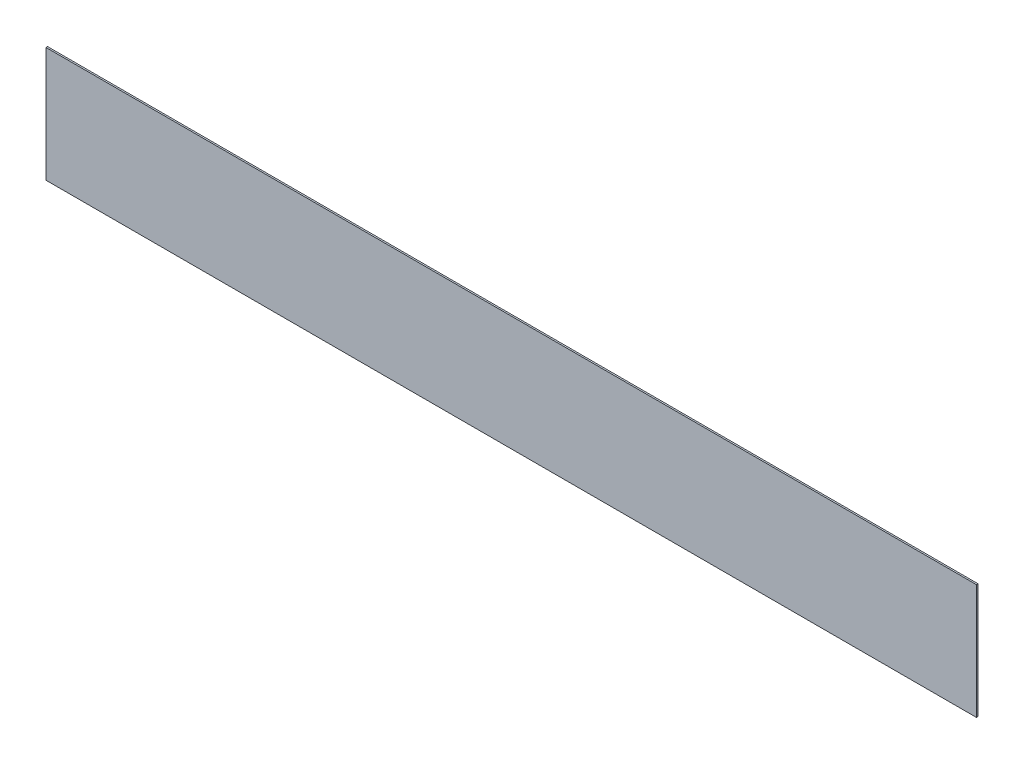
ISO-10303-21;
HEADER;
FILE_DESCRIPTION(('STEP AP214'),'2;1');
FILE_NAME('part.step','',(''),(''),'','','');
FILE_SCHEMA(('AUTOMOTIVE_DESIGN { 1 0 10303 214 1 1 1 1 }'));
ENDSEC;
DATA;
#1=APPLICATION_CONTEXT('core data for automotive mechanical design processes');
#2=APPLICATION_PROTOCOL_DEFINITION('international standard','automotive_design',2000,#1);
#3=PRODUCT_CONTEXT('',#1,'mechanical');
#4=PRODUCT('Part','Part','',(#3));
#5=PRODUCT_RELATED_PRODUCT_CATEGORY('part','',(#4));
#6=PRODUCT_DEFINITION_FORMATION('','',#4);
#7=PRODUCT_DEFINITION_CONTEXT('part definition',#1,'design');
#8=PRODUCT_DEFINITION('design','',#6,#7);
#9=PRODUCT_DEFINITION_SHAPE('','',#8);
#10=(LENGTH_UNIT() NAMED_UNIT(*) SI_UNIT(.MILLI.,.METRE.));
#11=(NAMED_UNIT(*) PLANE_ANGLE_UNIT() SI_UNIT($,.RADIAN.));
#12=(NAMED_UNIT(*) SI_UNIT($,.STERADIAN.) SOLID_ANGLE_UNIT());
#13=UNCERTAINTY_MEASURE_WITH_UNIT(LENGTH_MEASURE(1.E-05),#10,'distance_accuracy_value','');
#14=(GEOMETRIC_REPRESENTATION_CONTEXT(3) GLOBAL_UNCERTAINTY_ASSIGNED_CONTEXT((#13)) GLOBAL_UNIT_ASSIGNED_CONTEXT((#10,
#11,#12)) REPRESENTATION_CONTEXT('',''));
#15=CARTESIAN_POINT('',(0.,0.,0.));
#16=DIRECTION('',(0.,0.,1.));
#17=DIRECTION('',(1.,0.,0.));
#18=AXIS2_PLACEMENT_3D('',#15,#16,#17);
#19=CARTESIAN_POINT('',(13.7,8.,-700.));
#20=DIRECTION('',(-1.,0.,0.));
#21=DIRECTION('',(0.,0.,1.));
#22=AXIS2_PLACEMENT_3D('',#19,#20,#21);
#23=PLANE('',#22);
#24=DIRECTION('',(0.,-1.,0.));
#25=VECTOR('',#24,1.);
#26=CARTESIAN_POINT('',(13.7,8.,-699.));
#27=LINE('',#26,#25);
#28=CARTESIAN_POINT('',(13.7,81.,-699.));
#29=VERTEX_POINT('',#28);
#30=CARTESIAN_POINT('',(13.7,8.,-699.));
#31=VERTEX_POINT('',#30);
#32=EDGE_CURVE('E103',#29,#31,#27,.T.);
#33=ORIENTED_EDGE('',*,*,#32,.F.);
#34=DIRECTION('',(0.,0.,1.));
#35=VECTOR('',#34,1.);
#36=CARTESIAN_POINT('',(13.7,81.,-700.));
#37=LINE('',#36,#35);
#38=CARTESIAN_POINT('',(13.7,81.,-700.));
#39=VERTEX_POINT('',#38);
#40=EDGE_CURVE('E11',#39,#29,#37,.T.);
#41=ORIENTED_EDGE('',*,*,#40,.F.);
#42=DIRECTION('',(0.,-1.,0.));
#43=VECTOR('',#42,1.);
#44=CARTESIAN_POINT('',(13.7,8.,-700.));
#45=LINE('',#44,#43);
#46=CARTESIAN_POINT('',(13.7,8.,-700.));
#47=VERTEX_POINT('',#46);
#48=EDGE_CURVE('E97',#39,#47,#45,.T.);
#49=ORIENTED_EDGE('',*,*,#48,.T.);
#50=DIRECTION('',(0.,0.,1.));
#51=VECTOR('',#50,1.);
#52=CARTESIAN_POINT('',(13.7,8.,-700.));
#53=LINE('',#52,#51);
#54=EDGE_CURVE('E42',#47,#31,#53,.T.);
#55=ORIENTED_EDGE('',*,*,#54,.T.);
#56=EDGE_LOOP('',(#33,#41,#49,#55));
#57=FACE_BOUND('',#56,.T.);
#58=ADVANCED_FACE('F39',(#57),#23,.T.);
#59=CARTESIAN_POINT('',(13.7,81.,-700.));
#60=DIRECTION('',(0.,1.,0.));
#61=DIRECTION('',(0.,0.,1.));
#62=AXIS2_PLACEMENT_3D('',#59,#60,#61);
#63=PLANE('',#62);
#64=DIRECTION('',(-1.,0.,0.));
#65=VECTOR('',#64,1.);
#66=CARTESIAN_POINT('',(13.7,81.,-699.));
#67=LINE('',#66,#65);
#68=CARTESIAN_POINT('',(604.3,81.,-699.));
#69=VERTEX_POINT('',#68);
#70=EDGE_CURVE('E99',#69,#29,#67,.T.);
#71=ORIENTED_EDGE('',*,*,#70,.F.);
#72=DIRECTION('',(0.,0.,1.));
#73=VECTOR('',#72,1.);
#74=CARTESIAN_POINT('',(604.3,81.,-700.));
#75=LINE('',#74,#73);
#76=CARTESIAN_POINT('',(604.3,81.,-700.));
#77=VERTEX_POINT('',#76);
#78=EDGE_CURVE('E48',#77,#69,#75,.T.);
#79=ORIENTED_EDGE('',*,*,#78,.F.);
#80=DIRECTION('',(-1.,0.,0.));
#81=VECTOR('',#80,1.);
#82=CARTESIAN_POINT('',(13.7,81.,-700.));
#83=LINE('',#82,#81);
#84=EDGE_CURVE('E94',#77,#39,#83,.T.);
#85=ORIENTED_EDGE('',*,*,#84,.T.);
#86=ORIENTED_EDGE('',*,*,#40,.T.);
#87=EDGE_LOOP('',(#71,#79,#85,#86));
#88=FACE_BOUND('',#87,.T.);
#89=ADVANCED_FACE('F113',(#88),#63,.T.);
#90=CARTESIAN_POINT('',(604.3,8.,-700.));
#91=DIRECTION('',(1.,0.,0.));
#92=DIRECTION('',(0.,0.,-1.));
#93=AXIS2_PLACEMENT_3D('',#90,#91,#92);
#94=PLANE('',#93);
#95=DIRECTION('',(0.,1.,0.));
#96=VECTOR('',#95,1.);
#97=CARTESIAN_POINT('',(604.3,8.,-699.));
#98=LINE('',#97,#96);
#99=CARTESIAN_POINT('',(604.3,8.,-699.));
#100=VERTEX_POINT('',#99);
#101=EDGE_CURVE('E89',#100,#69,#98,.T.);
#102=ORIENTED_EDGE('',*,*,#101,.F.);
#103=DIRECTION('',(0.,0.,1.));
#104=VECTOR('',#103,1.);
#105=CARTESIAN_POINT('',(604.3,8.,-700.));
#106=LINE('',#105,#104);
#107=CARTESIAN_POINT('',(604.3,8.,-700.));
#108=VERTEX_POINT('',#107);
#109=EDGE_CURVE('E84',#108,#100,#106,.T.);
#110=ORIENTED_EDGE('',*,*,#109,.F.);
#111=DIRECTION('',(0.,1.,0.));
#112=VECTOR('',#111,1.);
#113=CARTESIAN_POINT('',(604.3,8.,-700.));
#114=LINE('',#113,#112);
#115=EDGE_CURVE('E87',#108,#77,#114,.T.);
#116=ORIENTED_EDGE('',*,*,#115,.T.);
#117=ORIENTED_EDGE('',*,*,#78,.T.);
#118=EDGE_LOOP('',(#102,#110,#116,#117));
#119=FACE_BOUND('',#118,.T.);
#120=ADVANCED_FACE('F86',(#119),#94,.T.);
#121=CARTESIAN_POINT('',(13.7,8.,-700.));
#122=DIRECTION('',(0.,-1.,0.));
#123=DIRECTION('',(0.,0.,-1.));
#124=AXIS2_PLACEMENT_3D('',#121,#122,#123);
#125=PLANE('',#124);
#126=DIRECTION('',(1.,0.,0.));
#127=VECTOR('',#126,1.);
#128=CARTESIAN_POINT('',(13.7,8.,-699.));
#129=LINE('',#128,#127);
#130=EDGE_CURVE('E106',#31,#100,#129,.T.);
#131=ORIENTED_EDGE('',*,*,#130,.F.);
#132=ORIENTED_EDGE('',*,*,#54,.F.);
#133=DIRECTION('',(1.,0.,0.));
#134=VECTOR('',#133,1.);
#135=CARTESIAN_POINT('',(13.7,8.,-700.));
#136=LINE('',#135,#134);
#137=EDGE_CURVE('E93',#47,#108,#136,.T.);
#138=ORIENTED_EDGE('',*,*,#137,.T.);
#139=ORIENTED_EDGE('',*,*,#109,.T.);
#140=EDGE_LOOP('',(#131,#132,#138,#139));
#141=FACE_BOUND('',#140,.T.);
#142=ADVANCED_FACE('F96',(#141),#125,.T.);
#143=CARTESIAN_POINT('',(0.,0.,-700.));
#144=DIRECTION('',(0.,0.,-1.));
#145=DIRECTION('',(-1.,0.,0.));
#146=AXIS2_PLACEMENT_3D('',#143,#144,#145);
#147=PLANE('',#146);
#148=ORIENTED_EDGE('',*,*,#48,.F.);
#149=ORIENTED_EDGE('',*,*,#84,.F.);
#150=ORIENTED_EDGE('',*,*,#115,.F.);
#151=ORIENTED_EDGE('',*,*,#137,.F.);
#152=EDGE_LOOP('',(#148,#149,#150,#151));
#153=FACE_BOUND('',#152,.T.);
#154=ADVANCED_FACE('F92',(#153),#147,.T.);
#155=CARTESIAN_POINT('',(0.,0.,-699.));
#156=DIRECTION('',(0.,0.,-1.));
#157=DIRECTION('',(-1.,0.,0.));
#158=AXIS2_PLACEMENT_3D('',#155,#156,#157);
#159=PLANE('',#158);
#160=ORIENTED_EDGE('',*,*,#32,.T.);
#161=ORIENTED_EDGE('',*,*,#130,.T.);
#162=ORIENTED_EDGE('',*,*,#101,.T.);
#163=ORIENTED_EDGE('',*,*,#70,.T.);
#164=EDGE_LOOP('',(#160,#161,#162,#163));
#165=FACE_BOUND('',#164,.T.);
#166=ADVANCED_FACE('F112',(#165),#159,.F.);
#167=CLOSED_SHELL('',(#58,#89,#120,#142,#154,#166));
#168=MANIFOLD_SOLID_BREP('B2',#167);
#169=ADVANCED_BREP_SHAPE_REPRESENTATION('',(#18,#168),#14);
#170=SHAPE_DEFINITION_REPRESENTATION(#9,#169);
ENDSEC;
END-ISO-10303-21;
